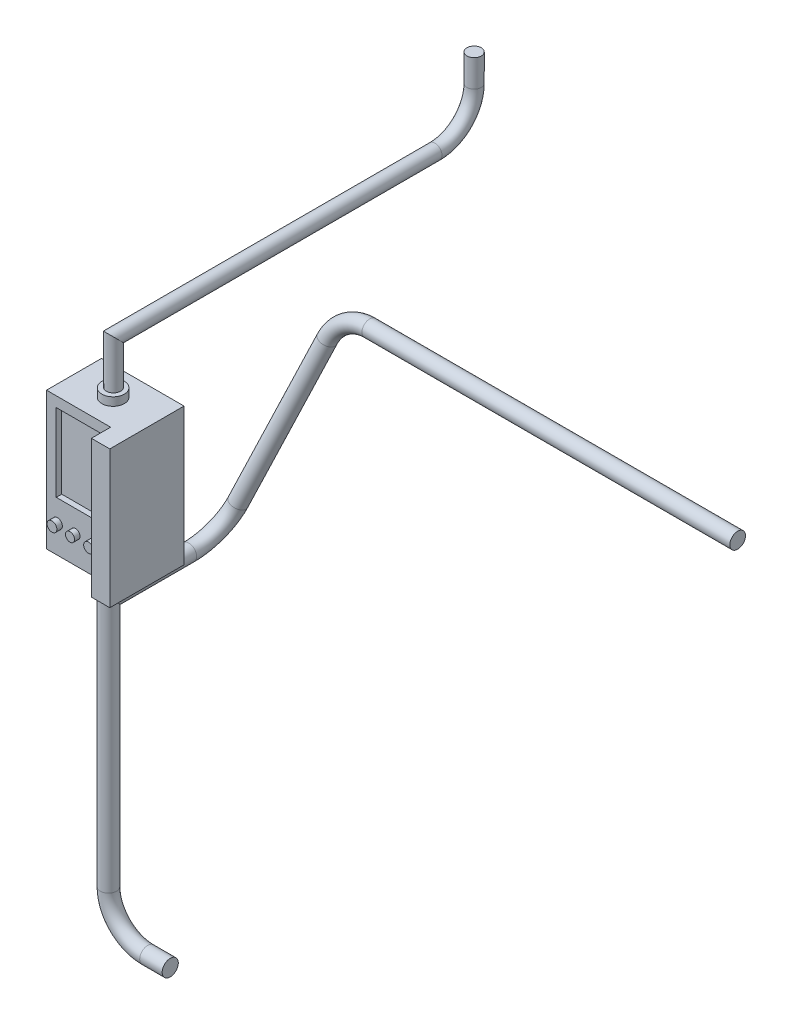
ISO-10303-21;
HEADER;
FILE_DESCRIPTION(('STEP AP214'),'2;1');
FILE_NAME('part.step','',(''),(''),'','','');
FILE_SCHEMA(('AUTOMOTIVE_DESIGN { 1 0 10303 214 1 1 1 1 }'));
ENDSEC;
DATA;
#1=APPLICATION_CONTEXT('core data for automotive mechanical design processes');
#2=APPLICATION_PROTOCOL_DEFINITION('international standard','automotive_design',2000,#1);
#3=PRODUCT_CONTEXT('',#1,'mechanical');
#4=PRODUCT('Part','Part','',(#3));
#5=PRODUCT_RELATED_PRODUCT_CATEGORY('part','',(#4));
#6=PRODUCT_DEFINITION_FORMATION('','',#4);
#7=PRODUCT_DEFINITION_CONTEXT('part definition',#1,'design');
#8=PRODUCT_DEFINITION('design','',#6,#7);
#9=PRODUCT_DEFINITION_SHAPE('','',#8);
#10=(LENGTH_UNIT() NAMED_UNIT(*) SI_UNIT(.MILLI.,.METRE.));
#11=(NAMED_UNIT(*) PLANE_ANGLE_UNIT() SI_UNIT($,.RADIAN.));
#12=(NAMED_UNIT(*) SI_UNIT($,.STERADIAN.) SOLID_ANGLE_UNIT());
#13=UNCERTAINTY_MEASURE_WITH_UNIT(LENGTH_MEASURE(1.E-05),#10,'distance_accuracy_value','');
#14=(GEOMETRIC_REPRESENTATION_CONTEXT(3) GLOBAL_UNCERTAINTY_ASSIGNED_CONTEXT((#13)) GLOBAL_UNIT_ASSIGNED_CONTEXT((#10,
#11,#12)) REPRESENTATION_CONTEXT('',''));
#15=CARTESIAN_POINT('',(0.,0.,0.));
#16=DIRECTION('',(0.,0.,1.));
#17=DIRECTION('',(1.,0.,0.));
#18=AXIS2_PLACEMENT_3D('',#15,#16,#17);
#19=CARTESIAN_POINT('',(-15.1656838034882,-1.44697494777078,10.0810756569558));
#20=DIRECTION('',(0.,-1.,0.));
#21=DIRECTION('',(1.,0.,0.));
#22=AXIS2_PLACEMENT_3D('',#19,#20,#21);
#23=CYLINDRICAL_SURFACE('',#22,2.05256225198221);
#24=CARTESIAN_POINT('',(-15.1656838034882,-1.44697494777078,10.0810756569558));
#25=DIRECTION('',(0.,-1.,0.));
#26=DIRECTION('',(0.,0.,-1.));
#27=AXIS2_PLACEMENT_3D('',#24,#25,#26);
#28=CIRCLE('',#27,2.05256225198221);
#29=CARTESIAN_POINT('',(-15.1656838034882,-1.44697494777078,8.02851340497361));
#30=VERTEX_POINT('',#29);
#31=EDGE_CURVE('E12',#30,#30,#28,.T.);
#32=ORIENTED_EDGE('',*,*,#31,.T.);
#33=EDGE_LOOP('',(#32));
#34=FACE_BOUND('',#33,.T.);
#35=CARTESIAN_POINT('',(-15.1656838034882,-75.1126954262071,10.0810756569558));
#36=DIRECTION('',(0.,-1.,0.));
#37=DIRECTION('',(0.,0.,-1.));
#38=AXIS2_PLACEMENT_3D('',#35,#36,#37);
#39=CIRCLE('',#38,2.05256225198221);
#40=CARTESIAN_POINT('',(-17.2182460554704,-75.1126954262071,10.0810756569558));
#41=VERTEX_POINT('',#40);
#42=EDGE_CURVE('E673',#41,#41,#39,.T.);
#43=ORIENTED_EDGE('',*,*,#42,.F.);
#44=EDGE_LOOP('',(#43));
#45=FACE_BOUND('',#44,.T.);
#46=CARTESIAN_POINT('',(-17.1707576265818,-11.6379271491596,9.6421100977065));
#47=CARTESIAN_POINT('',(-17.1707562385758,-11.6683769514016,9.64210011184391));
#48=CARTESIAN_POINT('',(-17.1700462371276,-11.6988839868901,9.6388263052876));
#49=CARTESIAN_POINT('',(-17.1673168978783,-11.7587317031309,9.62663833255918));
#50=CARTESIAN_POINT('',(-17.16529057085,-11.7880652654225,9.61769406436042));
#51=CARTESIAN_POINT('',(-17.1574559452225,-11.8750724914424,9.58474539158271));
#52=CARTESIAN_POINT('',(-17.1499101080387,-11.9301978462975,9.55478500641295));
#53=CARTESIAN_POINT('',(-17.1312579493921,-12.0361435780843,9.48882960335566));
#54=CARTESIAN_POINT('',(-17.1201222844179,-12.0869239524873,9.4527860603048));
#55=CARTESIAN_POINT('',(-17.089517100964,-12.2052225727835,9.36352469162417));
#56=CARTESIAN_POINT('',(-17.0684925013067,-12.2714632113716,9.30913033692371));
#57=CARTESIAN_POINT('',(-17.0201043276044,-12.4006268944419,9.19915403198198));
#58=CARTESIAN_POINT('',(-16.992732005946,-12.4635452122737,9.14357053986423));
#59=CARTESIAN_POINT('',(-16.9315867417749,-12.5863384747313,9.03294502015295));
#60=CARTESIAN_POINT('',(-16.8978331552121,-12.6462219457306,8.97790187135118));
#61=CARTESIAN_POINT('',(-16.8236732282258,-12.7630282868898,8.86929668361847));
#62=CARTESIAN_POINT('',(-16.7832722099263,-12.819953477943,8.81573349953127));
#63=CARTESIAN_POINT('',(-16.6748289474755,-12.9565819078633,8.68622557334252));
#64=CARTESIAN_POINT('',(-16.6027258677566,-13.0343983672529,8.61160970349412));
#65=CARTESIAN_POINT('',(-16.4426536892445,-13.1805640620557,8.47057628692153));
#66=CARTESIAN_POINT('',(-16.354709637301,-13.2489279459731,8.40414607280802));
#67=CARTESIAN_POINT('',(-16.1855276073578,-13.3579644436196,8.29770631448137));
#68=CARTESIAN_POINT('',(-16.1076526530937,-13.4013582477186,8.25516822737148));
#69=CARTESIAN_POINT('',(-15.9430615737329,-13.4785108817884,8.17926335211292));
#70=CARTESIAN_POINT('',(-15.8563498495212,-13.5122744762724,8.14589202904198));
#71=CARTESIAN_POINT('',(-15.6747242846835,-13.5681669639767,8.09035148658371));
#72=CARTESIAN_POINT('',(-15.5797376916956,-13.5901772695683,8.06829653026528));
#73=CARTESIAN_POINT('',(-15.3854407707692,-13.6199895276634,8.0379540099666));
#74=CARTESIAN_POINT('',(-15.2861357957448,-13.6278085844782,8.02964987357142));
#75=CARTESIAN_POINT('',(-15.1027132032089,-13.6283954885508,8.0277519671223));
#76=CARTESIAN_POINT('',(-15.0186114403326,-13.6232954493794,8.03209006447367));
#77=CARTESIAN_POINT('',(-14.8528367053792,-13.6027453078849,8.05078174414436));
#78=CARTESIAN_POINT('',(-14.7711638723318,-13.5872946142866,8.06513589862703));
#79=CARTESIAN_POINT('',(-14.6141395578294,-13.5475179312297,8.1023924587376));
#80=CARTESIAN_POINT('',(-14.5386879987864,-13.5233965711083,8.1250980351732));
#81=CARTESIAN_POINT('',(-14.3934058894673,-13.4675188421523,8.17776833738789));
#82=CARTESIAN_POINT('',(-14.3235770358122,-13.4357601802417,8.20773524337905));
#83=CARTESIAN_POINT('',(-14.1592021858172,-13.3496343987704,8.28890666111121));
#84=CARTESIAN_POINT('',(-14.0682437171712,-13.2916183110039,8.3435099872447));
#85=CARTESIAN_POINT('',(-13.900230683788,-13.1652871117331,8.46174050659935));
#86=CARTESIAN_POINT('',(-13.823217021185,-13.0969427481185,8.5253932986984));
#87=CARTESIAN_POINT('',(-13.7053836480379,-12.9756485580221,8.6371737374218));
#88=CARTESIAN_POINT('',(-13.6608698907733,-12.9247748778824,8.68374788424051));
#89=CARTESIAN_POINT('',(-13.5779356028464,-12.8198897757411,8.77875405057606));
#90=CARTESIAN_POINT('',(-13.5395151786688,-12.765878298927,8.82718610254258));
#91=CARTESIAN_POINT('',(-13.4686000602384,-12.6550266071301,8.92497747391148));
#92=CARTESIAN_POINT('',(-13.4360995661828,-12.5981892309758,8.97433583292432));
#93=CARTESIAN_POINT('',(-13.3768198169641,-12.4815953247047,9.07297049763243));
#94=CARTESIAN_POINT('',(-13.350036873152,-12.421840707396,9.12224683575631));
#95=CARTESIAN_POINT('',(-13.3072184498617,-12.3119177930637,9.20876356223566));
#96=CARTESIAN_POINT('',(-13.2901090322296,-12.262422333246,9.24632989161793));
#97=CARTESIAN_POINT('',(-13.2594301870704,-12.1604960642387,9.31900545639254));
#98=CARTESIAN_POINT('',(-13.2458620615339,-12.1080641840265,9.35411378461511));
#99=CARTESIAN_POINT('',(-13.2256900184427,-12.013598193288,9.41019896872631));
#100=CARTESIAN_POINT('',(-13.2181939034898,-11.9725249439042,9.43244628696262));
#101=CARTESIAN_POINT('',(-13.20559195093,-11.8875465769644,9.47159054421215));
#102=CARTESIAN_POINT('',(-13.2004779473846,-11.8436517298239,9.48850569657765));
#103=CARTESIAN_POINT('',(-13.1942939422607,-11.7671606348129,9.50948339634258));
#104=CARTESIAN_POINT('',(-13.1924606171015,-11.7353011056488,9.51590778381817));
#105=CARTESIAN_POINT('',(-13.1903540916777,-11.6709325399297,9.52331112171574));
#106=CARTESIAN_POINT('',(-13.1900775010031,-11.6384250697199,9.52430190585485));
#107=CARTESIAN_POINT('',(-13.1911099196835,-11.5738015708135,9.52065484486587));
#108=CARTESIAN_POINT('',(-13.1924176102456,-11.5416852389899,9.51602168123788));
#109=CARTESIAN_POINT('',(-13.1964767100878,-11.4785626507359,9.50203541745119));
#110=CARTESIAN_POINT('',(-13.1992319976936,-11.4475596165422,9.49266964051329));
#111=CARTESIAN_POINT('',(-13.2089533899926,-11.3603781883047,9.46085610887501));
#112=CARTESIAN_POINT('',(-13.2174927185067,-11.3059893379918,9.43414158898662));
#113=CARTESIAN_POINT('',(-13.2381294082466,-11.2011030505468,9.37499666223198));
#114=CARTESIAN_POINT('',(-13.2502444179536,-11.1506265219349,9.34253823114032));
#115=CARTESIAN_POINT('',(-13.2804751696835,-11.0426199177359,9.26810573422655));
#116=CARTESIAN_POINT('',(-13.2993073490884,-10.9857084481304,9.22552959705876));
#117=CARTESIAN_POINT('',(-13.3415191722809,-10.8747602763609,9.13885818501345));
#118=CARTESIAN_POINT('',(-13.3649033475438,-10.82072650776,9.0947614326703));
#119=CARTESIAN_POINT('',(-13.4162443654835,-10.7151013877025,9.00632561793709));
#120=CARTESIAN_POINT('',(-13.4441999753943,-10.6635093826054,8.96198662397888));
#121=CARTESIAN_POINT('',(-13.5047755142522,-10.5626728450185,8.87390787766344));
#122=CARTESIAN_POINT('',(-13.5373932589209,-10.5134272275379,8.83016785513681));
#123=CARTESIAN_POINT('',(-13.636843401428,-10.3770228917468,8.70772313210882));
#124=CARTESIAN_POINT('',(-13.7094429674093,-10.292673461405,8.6304325045257));
#125=CARTESIAN_POINT('',(-13.8718606716603,-10.134237543975,8.48390066694397));
#126=CARTESIAN_POINT('',(-13.9616467276544,-10.0601323708243,8.41464483917553));
#127=CARTESIAN_POINT('',(-14.1327961431566,-9.94356694224223,8.30524471239181));
#128=CARTESIAN_POINT('',(-14.2101401307153,-9.89791443684827,8.26223900768829));
#129=CARTESIAN_POINT('',(-14.3738978541586,-9.8162281563539,8.18522706381717));
#130=CARTESIAN_POINT('',(-14.4603004837665,-9.78018279028216,8.15120998034756));
#131=CARTESIAN_POINT('',(-14.6272646998079,-9.72445878957076,8.09875524956262));
#132=CARTESIAN_POINT('',(-14.7067826590744,-9.70314296796166,8.07875265290483));
#133=CARTESIAN_POINT('',(-14.8696113346887,-9.67040813327407,8.04829493826342));
#134=CARTESIAN_POINT('',(-14.9529198587521,-9.65898347430356,8.03783437348912));
#135=CARTESIAN_POINT('',(-15.1212233335842,-9.64680953527335,8.02725911346089));
#136=CARTESIAN_POINT('',(-15.2062224341695,-9.64609095188878,8.02717416236463));
#137=CARTESIAN_POINT('',(-15.3749801257291,-9.6554353944807,8.03746208867531));
#138=CARTESIAN_POINT('',(-15.4587385441576,-9.66549990608698,8.04783640708569));
#139=CARTESIAN_POINT('',(-15.6190763152071,-9.69499279951662,8.07762375994301));
#140=CARTESIAN_POINT('',(-15.695809485336,-9.71400569009518,8.09663454353421));
#141=CARTESIAN_POINT('',(-15.844356952571,-9.7600694875636,8.14239905766324));
#142=CARTESIAN_POINT('',(-15.9161693766855,-9.7871234344497,8.16915571650168));
#143=CARTESIAN_POINT('',(-16.0812712926284,-9.86009541391372,8.24104562330932));
#144=CARTESIAN_POINT('',(-16.1717970485938,-9.90924060200667,8.28925954560956));
#145=CARTESIAN_POINT('',(-16.3405288702634,-10.0175924016071,8.39503779787191));
#146=CARTESIAN_POINT('',(-16.4187077770046,-10.0768206141768,8.4526221904352));
#147=CARTESIAN_POINT('',(-16.5895187968733,-10.2262075569568,8.59702461659752));
#148=CARTESIAN_POINT('',(-16.6767781137223,-10.3196969430244,8.68677030414259));
#149=CARTESIAN_POINT('',(-16.7913143596522,-10.4673483442454,8.82649339310361));
#150=CARTESIAN_POINT('',(-16.8267944358785,-10.5178549559429,8.87396765518812));
#151=CARTESIAN_POINT('',(-16.8925196339269,-10.6211541134422,8.97002362073492));
#152=CARTESIAN_POINT('',(-16.9227665096953,-10.6739458859102,9.01860494695434));
#153=CARTESIAN_POINT('',(-16.9883100043343,-10.8013865113274,9.13403516195702));
#154=CARTESIAN_POINT('',(-17.0214279891096,-10.8769876984115,9.20108738641287));
#155=CARTESIAN_POINT('',(-17.064195785077,-10.9940952754103,9.30007446246959));
#156=CARTESIAN_POINT('',(-17.0772941887342,-11.0337229933015,9.33278511067768));
#157=CARTESIAN_POINT('',(-17.1011913215978,-11.1146232516802,9.3969797190091));
#158=CARTESIAN_POINT('',(-17.1119914318608,-11.1558947865862,9.42846440647167));
#159=CARTESIAN_POINT('',(-17.1294291849901,-11.2328948134437,9.48326028915612));
#160=CARTESIAN_POINT('',(-17.1364674424433,-11.2682239745075,9.50700160429208));
#161=CARTESIAN_POINT('',(-17.1488525769852,-11.3411446468742,9.55138002339139));
#162=CARTESIAN_POINT('',(-17.1542003762616,-11.3787349113189,9.5720188166249));
#163=CARTESIAN_POINT('',(-17.1615338115833,-11.4446501917427,9.60175011034675));
#164=CARTESIAN_POINT('',(-17.1640478955334,-11.4721770870777,9.61243312985159));
#165=CARTESIAN_POINT('',(-17.16795154088,-11.5286074200084,9.62939642923683));
#166=CARTESIAN_POINT('',(-17.1693461576787,-11.5575040379397,9.63569648474448));
#167=CARTESIAN_POINT('',(-17.1703177234464,-11.5952206746369,9.64010483020651));
#168=CARTESIAN_POINT('',(-17.1704823078874,-11.6037435274243,9.64085396126065));
#169=CARTESIAN_POINT('',(-17.1707024511195,-11.6208184646108,9.64185798284877));
#170=CARTESIAN_POINT('',(-17.1707580166209,-11.6293705471784,9.64211290380196));
#171=CARTESIAN_POINT('',(-17.1707576265818,-11.6379271491596,9.6421100977065));
#172=B_SPLINE_CURVE_WITH_KNOTS('',3,(#46,#47,#48,#49,#50,#51,#52,#53,#54,#55,#56,#57,#58,#59,
#60,#61,#62,#63,#64,#65,#66,#67,#68,#69,#70,#71,#72,#73,#74,#75,#76,#77,#78,#79,#80,#81,#82,#83,
#84,#85,#86,#87,#88,#89,#90,#91,#92,#93,#94,#95,#96,#97,#98,#99,#100,#101,#102,#103,#104,#105,
#106,#107,#108,#109,#110,#111,#112,#113,#114,#115,#116,#117,#118,#119,#120,#121,#122,#123,#124,
#125,#126,#127,#128,#129,#130,#131,#132,#133,#134,#135,#136,#137,#138,#139,#140,#141,#142,#143,
#144,#145,#146,#147,#148,#149,#150,#151,#152,#153,#154,#155,#156,#157,#158,#159,#160,#161,#162,
#163,#164,#165,#166,#167,#168,#169,#170,#171),.UNSPECIFIED.,.T.,.F.,(4,2,2,2,2,2,2,2,2,2,2,2,2,
2,2,2,2,2,2,2,2,2,2,2,2,2,2,2,2,2,2,2,2,2,2,2,2,2,2,2,2,2,2,2,2,2,2,2,2,2,2,2,2,2,2,2,2,2,2,2,2,
2,4),(0.,0.0913056403874695,0.183100088593291,0.37118247259093,0.560842989144096,
0.825143184449923,1.08980979169786,1.35368611901524,1.61735219833802,2.00509292356575,
2.39222587235196,2.6874686149502,2.98256503283015,3.28058518179503,3.57824589635369,
3.83007477021042,4.081918030871,4.32817081762585,4.57449763352368,4.93525766742161,
5.29705930169088,5.54303419914769,5.78901339469353,6.03475029083835,6.28032816870983,
6.47354050045255,6.66682376884279,6.80850864896924,6.94970418890205,7.04694358063466,
7.14397111262753,7.24091793208794,7.33812582088723,7.5206615271591,7.70411368629688,
7.92439904528953,8.14490482852408,8.36535124633931,8.58569471827848,8.99067627697831,
9.39490909582418,9.69257768556846,9.98988549687453,10.2429584579724,10.4958868691861,
10.7495403427149,11.0032287675836,11.2461516274062,11.4891664435492,11.8284653420381,
12.168500491339,12.6344879312147,12.8679406377712,13.1013149486998,13.4197632279023,
13.5787898467863,13.737720634208,13.8670497253002,13.996308141851,14.0849689722862,
14.173227130515,14.1988862172159,14.2245437245199),.UNSPECIFIED.);
#173=CARTESIAN_POINT('',(-17.1707576265818,-11.6379271491596,9.6421100977065));
#174=VERTEX_POINT('',#173);
#175=EDGE_CURVE('E58',#174,#174,#172,.T.);
#176=ORIENTED_EDGE('',*,*,#175,.T.);
#177=EDGE_LOOP('',(#176));
#178=FACE_BOUND('',#177,.T.);
#179=ADVANCED_FACE('F54',(#34,#45,#178),#23,.T.);
#180=CARTESIAN_POINT('',(-2.79503351726008,33.5530250522292,17.2211825238552));
#181=DIRECTION('',(-1.,0.,0.));
#182=DIRECTION('',(0.,-1.,0.));
#183=AXIS2_PLACEMENT_3D('',#180,#181,#182);
#184=PLANE('',#183);
#185=DIRECTION('',(0.,1.,0.));
#186=VECTOR('',#185,1.);
#187=CARTESIAN_POINT('',(-2.79503351726008,33.5530250522292,3.22118252385515));
#188=LINE('',#187,#186);
#189=CARTESIAN_POINT('',(-2.79503351726008,-1.44697494777078,3.22118252385515));
#190=VERTEX_POINT('',#189);
#191=CARTESIAN_POINT('',(-2.79503351726008,33.5530250522292,3.22118252385515));
#192=VERTEX_POINT('',#191);
#193=EDGE_CURVE('E191',#190,#192,#188,.T.);
#194=ORIENTED_EDGE('',*,*,#193,.T.);
#195=DIRECTION('',(0.,0.,-1.));
#196=VECTOR('',#195,1.);
#197=CARTESIAN_POINT('',(-2.79503351726008,33.5530250522292,17.2211825238552));
#198=LINE('',#197,#196);
#199=CARTESIAN_POINT('',(-2.79503351726009,33.5530250522292,22.1211825238552));
#200=VERTEX_POINT('',#199);
#201=EDGE_CURVE('E218',#200,#192,#198,.T.);
#202=ORIENTED_EDGE('',*,*,#201,.F.);
#203=DIRECTION('',(0.,1.,0.));
#204=VECTOR('',#203,1.);
#205=CARTESIAN_POINT('',(-2.79503351726008,4.79872038171863,22.1211825238552));
#206=LINE('',#205,#204);
#207=CARTESIAN_POINT('',(-2.79503351726008,-1.44697494777078,22.1211825238552));
#208=VERTEX_POINT('',#207);
#209=EDGE_CURVE('E155',#208,#200,#206,.T.);
#210=ORIENTED_EDGE('',*,*,#209,.F.);
#211=DIRECTION('',(0.,0.,-1.));
#212=VECTOR('',#211,1.);
#213=CARTESIAN_POINT('',(-2.79503351726008,-1.44697494777078,17.2211825238552));
#214=LINE('',#213,#212);
#215=EDGE_CURVE('E203',#208,#190,#214,.T.);
#216=ORIENTED_EDGE('',*,*,#215,.T.);
#217=EDGE_LOOP('',(#194,#202,#210,#216));
#218=FACE_BOUND('',#217,.T.);
#219=ADVANCED_FACE('F56',(#218),#184,.F.);
#220=CARTESIAN_POINT('',(-23.7950335172601,33.5530250522292,17.2211825238552));
#221=DIRECTION('',(0.,-1.,0.));
#222=DIRECTION('',(0.,0.,-1.));
#223=AXIS2_PLACEMENT_3D('',#220,#221,#222);
#224=PLANE('',#223);
#225=CARTESIAN_POINT('',(-13.7667009731344,33.5530250522292,10.2983339924709));
#226=DIRECTION('',(0.,1.,0.));
#227=DIRECTION('',(0.,0.,1.));
#228=AXIS2_PLACEMENT_3D('',#225,#226,#227);
#229=CIRCLE('',#228,2.85205853885435);
#230=CARTESIAN_POINT('',(-13.7667009731344,33.5530250522292,13.1503925313252));
#231=VERTEX_POINT('',#230);
#232=EDGE_CURVE('E219',#231,#231,#229,.T.);
#233=ORIENTED_EDGE('',*,*,#232,.F.);
#234=EDGE_LOOP('',(#233));
#235=FACE_BOUND('',#234,.T.);
#236=DIRECTION('',(-1.,0.,0.));
#237=VECTOR('',#236,1.);
#238=CARTESIAN_POINT('',(-23.7950335172601,33.5530250522292,3.22118252385515));
#239=LINE('',#238,#237);
#240=CARTESIAN_POINT('',(-23.7950335172601,33.5530250522292,3.22118252385515));
#241=VERTEX_POINT('',#240);
#242=EDGE_CURVE('E206',#192,#241,#239,.T.);
#243=ORIENTED_EDGE('',*,*,#242,.T.);
#244=DIRECTION('',(0.,0.,-1.));
#245=VECTOR('',#244,1.);
#246=CARTESIAN_POINT('',(-23.7950335172601,33.5530250522292,17.2211825238552));
#247=LINE('',#246,#245);
#248=CARTESIAN_POINT('',(-23.7950335172601,33.5530250522292,17.2211825238552));
#249=VERTEX_POINT('',#248);
#250=EDGE_CURVE('E216',#249,#241,#247,.T.);
#251=ORIENTED_EDGE('',*,*,#250,.F.);
#252=DIRECTION('',(-1.,0.,0.));
#253=VECTOR('',#252,1.);
#254=CARTESIAN_POINT('',(-23.7950335172601,33.5530250522292,17.2211825238552));
#255=LINE('',#254,#253);
#256=CARTESIAN_POINT('',(-7.47858813150323,33.5530250522292,17.2211825238552));
#257=VERTEX_POINT('',#256);
#258=EDGE_CURVE('E161',#257,#249,#255,.T.);
#259=ORIENTED_EDGE('',*,*,#258,.F.);
#260=DIRECTION('',(0.,0.,-1.));
#261=VECTOR('',#260,1.);
#262=CARTESIAN_POINT('',(-7.47858813150323,33.5530250522292,22.1211825238552));
#263=LINE('',#262,#261);
#264=CARTESIAN_POINT('',(-7.47858813150323,33.5530250522292,22.1211825238552));
#265=VERTEX_POINT('',#264);
#266=EDGE_CURVE('E142',#265,#257,#263,.T.);
#267=ORIENTED_EDGE('',*,*,#266,.F.);
#268=DIRECTION('',(-1.,0.,0.));
#269=VECTOR('',#268,1.);
#270=CARTESIAN_POINT('',(-3.79211484142935,33.5530250522292,22.1211825238552));
#271=LINE('',#270,#269);
#272=EDGE_CURVE('E149',#200,#265,#271,.T.);
#273=ORIENTED_EDGE('',*,*,#272,.F.);
#274=ORIENTED_EDGE('',*,*,#201,.T.);
#275=EDGE_LOOP('',(#243,#251,#259,#267,#273,#274));
#276=FACE_BOUND('',#275,.T.);
#277=ADVANCED_FACE('F159',(#235,#276),#224,.F.);
#278=CARTESIAN_POINT('',(-23.7950335172601,33.5530250522292,17.2211825238552));
#279=DIRECTION('',(1.,0.,0.));
#280=DIRECTION('',(0.,1.,0.));
#281=AXIS2_PLACEMENT_3D('',#278,#279,#280);
#282=PLANE('',#281);
#283=DIRECTION('',(0.,-1.,0.));
#284=VECTOR('',#283,1.);
#285=CARTESIAN_POINT('',(-23.7950335172601,33.5530250522292,3.22118252385515));
#286=LINE('',#285,#284);
#287=CARTESIAN_POINT('',(-23.7950335172601,-1.44697494777078,3.22118252385515));
#288=VERTEX_POINT('',#287);
#289=EDGE_CURVE('E208',#241,#288,#286,.T.);
#290=ORIENTED_EDGE('',*,*,#289,.T.);
#291=DIRECTION('',(0.,0.,-1.));
#292=VECTOR('',#291,1.);
#293=CARTESIAN_POINT('',(-23.7950335172601,-1.44697494777078,17.2211825238552));
#294=LINE('',#293,#292);
#295=CARTESIAN_POINT('',(-23.7950335172601,-1.44697494777078,17.2211825238552));
#296=VERTEX_POINT('',#295);
#297=EDGE_CURVE('E213',#296,#288,#294,.T.);
#298=ORIENTED_EDGE('',*,*,#297,.F.);
#299=DIRECTION('',(0.,-1.,0.));
#300=VECTOR('',#299,1.);
#301=CARTESIAN_POINT('',(-23.7950335172601,33.5530250522292,17.2211825238552));
#302=LINE('',#301,#300);
#303=EDGE_CURVE('E198',#249,#296,#302,.T.);
#304=ORIENTED_EDGE('',*,*,#303,.F.);
#305=ORIENTED_EDGE('',*,*,#250,.T.);
#306=EDGE_LOOP('',(#290,#298,#304,#305));
#307=FACE_BOUND('',#306,.T.);
#308=ADVANCED_FACE('F259',(#307),#282,.F.);
#309=CARTESIAN_POINT('',(-23.7950335172601,-1.44697494777078,17.2211825238552));
#310=DIRECTION('',(0.,1.,0.));
#311=DIRECTION('',(0.,0.,1.));
#312=AXIS2_PLACEMENT_3D('',#309,#310,#311);
#313=PLANE('',#312);
#314=ORIENTED_EDGE('',*,*,#31,.F.);
#315=EDGE_LOOP('',(#314));
#316=FACE_BOUND('',#315,.T.);
#317=DIRECTION('',(1.,0.,0.));
#318=VECTOR('',#317,1.);
#319=CARTESIAN_POINT('',(-23.7950335172601,-1.44697494777078,3.22118252385515));
#320=LINE('',#319,#318);
#321=EDGE_CURVE('E199',#288,#190,#320,.T.);
#322=ORIENTED_EDGE('',*,*,#321,.T.);
#323=ORIENTED_EDGE('',*,*,#215,.F.);
#324=DIRECTION('',(1.,0.,0.));
#325=VECTOR('',#324,1.);
#326=CARTESIAN_POINT('',(-3.79211484142935,-1.44697494777078,22.1211825238552));
#327=LINE('',#326,#325);
#328=CARTESIAN_POINT('',(-7.47858813150323,-1.44697494777078,22.1211825238552));
#329=VERTEX_POINT('',#328);
#330=EDGE_CURVE('E148',#329,#208,#327,.T.);
#331=ORIENTED_EDGE('',*,*,#330,.F.);
#332=DIRECTION('',(0.,0.,-1.));
#333=VECTOR('',#332,1.);
#334=CARTESIAN_POINT('',(-7.47858813150323,-1.44697494777078,22.1211825238552));
#335=LINE('',#334,#333);
#336=CARTESIAN_POINT('',(-7.47858813150323,-1.44697494777078,17.2211825238552));
#337=VERTEX_POINT('',#336);
#338=EDGE_CURVE('E144',#329,#337,#335,.T.);
#339=ORIENTED_EDGE('',*,*,#338,.T.);
#340=DIRECTION('',(1.,0.,0.));
#341=VECTOR('',#340,1.);
#342=CARTESIAN_POINT('',(-23.7950335172601,-1.44697494777078,17.2211825238552));
#343=LINE('',#342,#341);
#344=EDGE_CURVE('E201',#296,#337,#343,.T.);
#345=ORIENTED_EDGE('',*,*,#344,.F.);
#346=ORIENTED_EDGE('',*,*,#297,.T.);
#347=EDGE_LOOP('',(#322,#323,#331,#339,#345,#346));
#348=FACE_BOUND('',#347,.T.);
#349=ADVANCED_FACE('F250',(#316,#348),#313,.F.);
#350=CARTESIAN_POINT('',(-3.79211484142935,4.79872038171863,17.2211825238552));
#351=DIRECTION('',(0.,0.,1.));
#352=DIRECTION('',(1.,0.,0.));
#353=AXIS2_PLACEMENT_3D('',#350,#351,#352);
#354=PLANE('',#353);
#355=CARTESIAN_POINT('',(-11.6962757974124,5.58898372160033,17.2211825238552));
#356=DIRECTION('',(0.,0.,1.));
#357=DIRECTION('',(1.,0.,0.));
#358=AXIS2_PLACEMENT_3D('',#355,#356,#357);
#359=CIRCLE('',#358,1.2472440046638);
#360=CARTESIAN_POINT('',(-10.4490317927486,5.58898372160033,17.2211825238552));
#361=VERTEX_POINT('',#360);
#362=EDGE_CURVE('E233',#361,#361,#359,.T.);
#363=ORIENTED_EDGE('',*,*,#362,.F.);
#364=EDGE_LOOP('',(#363));
#365=FACE_BOUND('',#364,.T.);
#366=CARTESIAN_POINT('',(-16.4212622631356,5.58898372160033,17.2211825238552));
#367=DIRECTION('',(0.,0.,1.));
#368=DIRECTION('',(1.,0.,0.));
#369=AXIS2_PLACEMENT_3D('',#366,#367,#368);
#370=CIRCLE('',#369,1.15096971644149);
#371=CARTESIAN_POINT('',(-15.2702925466941,5.58898372160033,17.2211825238552));
#372=VERTEX_POINT('',#371);
#373=EDGE_CURVE('E232',#372,#372,#370,.T.);
#374=ORIENTED_EDGE('',*,*,#373,.F.);
#375=EDGE_LOOP('',(#374));
#376=FACE_BOUND('',#375,.T.);
#377=CARTESIAN_POINT('',(-21.0060531802151,5.58898372160033,17.2211825238552));
#378=DIRECTION('',(0.,0.,1.));
#379=DIRECTION('',(1.,0.,0.));
#380=AXIS2_PLACEMENT_3D('',#377,#378,#379);
#381=CIRCLE('',#380,1.24837859010856);
#382=CARTESIAN_POINT('',(-19.7576745901066,5.58898372160033,17.2211825238552));
#383=VERTEX_POINT('',#382);
#384=EDGE_CURVE('E239',#383,#383,#381,.T.);
#385=ORIENTED_EDGE('',*,*,#384,.F.);
#386=EDGE_LOOP('',(#385));
#387=FACE_BOUND('',#386,.T.);
#388=DIRECTION('',(0.,-1.,0.));
#389=VECTOR('',#388,1.);
#390=CARTESIAN_POINT('',(-7.47858813150322,4.79872038171863,17.2211825238552));
#391=LINE('',#390,#389);
#392=EDGE_CURVE('E76',#257,#337,#391,.T.);
#393=ORIENTED_EDGE('',*,*,#392,.F.);
#394=ORIENTED_EDGE('',*,*,#258,.T.);
#395=ORIENTED_EDGE('',*,*,#303,.T.);
#396=ORIENTED_EDGE('',*,*,#344,.T.);
#397=EDGE_LOOP('',(#393,#394,#395,#396));
#398=FACE_BOUND('',#397,.T.);
#399=DIRECTION('',(0.,1.,0.));
#400=VECTOR('',#399,1.);
#401=CARTESIAN_POINT('',(-9.00534627880155,30.9557520115547,17.2211825238552));
#402=LINE('',#401,#400);
#403=CARTESIAN_POINT('',(-9.00534627880155,11.1653447041178,17.2211825238552));
#404=VERTEX_POINT('',#403);
#405=CARTESIAN_POINT('',(-9.00534627880155,30.9557520115547,17.2211825238552));
#406=VERTEX_POINT('',#405);
#407=EDGE_CURVE('E84',#404,#406,#402,.T.);
#408=ORIENTED_EDGE('',*,*,#407,.F.);
#409=DIRECTION('',(1.,0.,0.));
#410=VECTOR('',#409,1.);
#411=CARTESIAN_POINT('',(-21.3184685726939,11.1653447041178,17.2211825238552));
#412=LINE('',#411,#410);
#413=CARTESIAN_POINT('',(-21.3184685726939,11.1653447041178,17.2211825238552));
#414=VERTEX_POINT('',#413);
#415=EDGE_CURVE('E172',#414,#404,#412,.T.);
#416=ORIENTED_EDGE('',*,*,#415,.F.);
#417=DIRECTION('',(0.,-1.,0.));
#418=VECTOR('',#417,1.);
#419=CARTESIAN_POINT('',(-21.3184685726939,30.9557520115547,17.2211825238552));
#420=LINE('',#419,#418);
#421=CARTESIAN_POINT('',(-21.3184685726939,30.9557520115547,17.2211825238552));
#422=VERTEX_POINT('',#421);
#423=EDGE_CURVE('E184',#422,#414,#420,.T.);
#424=ORIENTED_EDGE('',*,*,#423,.F.);
#425=DIRECTION('',(-1.,0.,0.));
#426=VECTOR('',#425,1.);
#427=CARTESIAN_POINT('',(-21.3184685726939,30.9557520115547,17.2211825238552));
#428=LINE('',#427,#426);
#429=EDGE_CURVE('E163',#406,#422,#428,.T.);
#430=ORIENTED_EDGE('',*,*,#429,.F.);
#431=EDGE_LOOP('',(#408,#416,#424,#430));
#432=FACE_BOUND('',#431,.T.);
#433=ADVANCED_FACE('F261',(#365,#376,#387,#398,#432),#354,.T.);
#434=CARTESIAN_POINT('',(-3.79211484142935,4.79872038171863,3.22118252385515));
#435=DIRECTION('',(0.,0.,1.));
#436=DIRECTION('',(1.,0.,0.));
#437=AXIS2_PLACEMENT_3D('',#434,#435,#436);
#438=PLANE('',#437);
#439=ORIENTED_EDGE('',*,*,#193,.F.);
#440=ORIENTED_EDGE('',*,*,#321,.F.);
#441=ORIENTED_EDGE('',*,*,#289,.F.);
#442=ORIENTED_EDGE('',*,*,#242,.F.);
#443=EDGE_LOOP('',(#439,#440,#441,#442));
#444=FACE_BOUND('',#443,.T.);
#445=ADVANCED_FACE('F255',(#444),#438,.F.);
#446=CARTESIAN_POINT('',(-9.00534627880155,30.9557520115547,15.8211825238552));
#447=DIRECTION('',(1.,0.,0.));
#448=DIRECTION('',(0.,0.,-1.));
#449=AXIS2_PLACEMENT_3D('',#446,#447,#448);
#450=PLANE('',#449);
#451=ORIENTED_EDGE('',*,*,#407,.T.);
#452=DIRECTION('',(0.,0.,1.));
#453=VECTOR('',#452,1.);
#454=CARTESIAN_POINT('',(-9.00534627880155,30.9557520115547,15.8211825238552));
#455=LINE('',#454,#453);
#456=CARTESIAN_POINT('',(-9.00534627880155,30.9557520115547,15.8211825238552));
#457=VERTEX_POINT('',#456);
#458=EDGE_CURVE('E180',#457,#406,#455,.T.);
#459=ORIENTED_EDGE('',*,*,#458,.F.);
#460=DIRECTION('',(0.,1.,0.));
#461=VECTOR('',#460,1.);
#462=CARTESIAN_POINT('',(-9.00534627880155,30.9557520115547,15.8211825238552));
#463=LINE('',#462,#461);
#464=CARTESIAN_POINT('',(-9.00534627880155,11.1653447041178,15.8211825238552));
#465=VERTEX_POINT('',#464);
#466=EDGE_CURVE('E168',#465,#457,#463,.T.);
#467=ORIENTED_EDGE('',*,*,#466,.F.);
#468=DIRECTION('',(0.,0.,1.));
#469=VECTOR('',#468,1.);
#470=CARTESIAN_POINT('',(-9.00534627880155,11.1653447041178,15.8211825238552));
#471=LINE('',#470,#469);
#472=EDGE_CURVE('E189',#465,#404,#471,.T.);
#473=ORIENTED_EDGE('',*,*,#472,.T.);
#474=EDGE_LOOP('',(#451,#459,#467,#473));
#475=FACE_BOUND('',#474,.T.);
#476=ADVANCED_FACE('F274',(#475),#450,.F.);
#477=CARTESIAN_POINT('',(-21.3184685726939,11.1653447041178,15.8211825238552));
#478=DIRECTION('',(0.,-1.,0.));
#479=DIRECTION('',(0.,0.,-1.));
#480=AXIS2_PLACEMENT_3D('',#477,#478,#479);
#481=PLANE('',#480);
#482=ORIENTED_EDGE('',*,*,#415,.T.);
#483=ORIENTED_EDGE('',*,*,#472,.F.);
#484=DIRECTION('',(1.,0.,0.));
#485=VECTOR('',#484,1.);
#486=CARTESIAN_POINT('',(-21.3184685726939,11.1653447041178,15.8211825238552));
#487=LINE('',#486,#485);
#488=CARTESIAN_POINT('',(-21.3184685726939,11.1653447041178,15.8211825238552));
#489=VERTEX_POINT('',#488);
#490=EDGE_CURVE('E178',#489,#465,#487,.T.);
#491=ORIENTED_EDGE('',*,*,#490,.F.);
#492=DIRECTION('',(0.,0.,1.));
#493=VECTOR('',#492,1.);
#494=CARTESIAN_POINT('',(-21.3184685726939,11.1653447041178,15.8211825238552));
#495=LINE('',#494,#493);
#496=EDGE_CURVE('E192',#489,#414,#495,.T.);
#497=ORIENTED_EDGE('',*,*,#496,.T.);
#498=EDGE_LOOP('',(#482,#483,#491,#497));
#499=FACE_BOUND('',#498,.T.);
#500=ADVANCED_FACE('F279',(#499),#481,.F.);
#501=CARTESIAN_POINT('',(-21.3184685726939,30.9557520115547,15.8211825238552));
#502=DIRECTION('',(-1.,0.,0.));
#503=DIRECTION('',(0.,0.,1.));
#504=AXIS2_PLACEMENT_3D('',#501,#502,#503);
#505=PLANE('',#504);
#506=ORIENTED_EDGE('',*,*,#423,.T.);
#507=ORIENTED_EDGE('',*,*,#496,.F.);
#508=DIRECTION('',(0.,-1.,0.));
#509=VECTOR('',#508,1.);
#510=CARTESIAN_POINT('',(-21.3184685726939,30.9557520115547,15.8211825238552));
#511=LINE('',#510,#509);
#512=CARTESIAN_POINT('',(-21.3184685726939,30.9557520115547,15.8211825238552));
#513=VERTEX_POINT('',#512);
#514=EDGE_CURVE('E175',#513,#489,#511,.T.);
#515=ORIENTED_EDGE('',*,*,#514,.F.);
#516=DIRECTION('',(0.,0.,1.));
#517=VECTOR('',#516,1.);
#518=CARTESIAN_POINT('',(-21.3184685726939,30.9557520115547,15.8211825238552));
#519=LINE('',#518,#517);
#520=EDGE_CURVE('E194',#513,#422,#519,.T.);
#521=ORIENTED_EDGE('',*,*,#520,.T.);
#522=EDGE_LOOP('',(#506,#507,#515,#521));
#523=FACE_BOUND('',#522,.T.);
#524=ADVANCED_FACE('F281',(#523),#505,.F.);
#525=CARTESIAN_POINT('',(-21.3184685726939,30.9557520115547,15.8211825238552));
#526=DIRECTION('',(0.,1.,0.));
#527=DIRECTION('',(0.,0.,1.));
#528=AXIS2_PLACEMENT_3D('',#525,#526,#527);
#529=PLANE('',#528);
#530=ORIENTED_EDGE('',*,*,#429,.T.);
#531=ORIENTED_EDGE('',*,*,#520,.F.);
#532=DIRECTION('',(-1.,0.,0.));
#533=VECTOR('',#532,1.);
#534=CARTESIAN_POINT('',(-21.3184685726939,30.9557520115547,15.8211825238552));
#535=LINE('',#534,#533);
#536=EDGE_CURVE('E171',#457,#513,#535,.T.);
#537=ORIENTED_EDGE('',*,*,#536,.F.);
#538=ORIENTED_EDGE('',*,*,#458,.T.);
#539=EDGE_LOOP('',(#530,#531,#537,#538));
#540=FACE_BOUND('',#539,.T.);
#541=ADVANCED_FACE('F270',(#540),#529,.F.);
#542=CARTESIAN_POINT('',(-3.79211484142935,4.79872038171863,15.8211825238552));
#543=DIRECTION('',(0.,0.,1.));
#544=DIRECTION('',(1.,0.,0.));
#545=AXIS2_PLACEMENT_3D('',#542,#543,#544);
#546=PLANE('',#545);
#547=ORIENTED_EDGE('',*,*,#466,.T.);
#548=ORIENTED_EDGE('',*,*,#536,.T.);
#549=ORIENTED_EDGE('',*,*,#514,.T.);
#550=ORIENTED_EDGE('',*,*,#490,.T.);
#551=EDGE_LOOP('',(#547,#548,#549,#550));
#552=FACE_BOUND('',#551,.T.);
#553=ADVANCED_FACE('F277',(#552),#546,.T.);
#554=CARTESIAN_POINT('',(-7.47858813150322,4.79872038171863,22.1211825238552));
#555=DIRECTION('',(1.,0.,0.));
#556=DIRECTION('',(0.,1.,0.));
#557=AXIS2_PLACEMENT_3D('',#554,#555,#556);
#558=PLANE('',#557);
#559=ORIENTED_EDGE('',*,*,#392,.T.);
#560=ORIENTED_EDGE('',*,*,#338,.F.);
#561=DIRECTION('',(0.,-1.,0.));
#562=VECTOR('',#561,1.);
#563=CARTESIAN_POINT('',(-7.47858813150322,4.79872038171863,22.1211825238552));
#564=LINE('',#563,#562);
#565=EDGE_CURVE('E138',#265,#329,#564,.T.);
#566=ORIENTED_EDGE('',*,*,#565,.F.);
#567=ORIENTED_EDGE('',*,*,#266,.T.);
#568=EDGE_LOOP('',(#559,#560,#566,#567));
#569=FACE_BOUND('',#568,.T.);
#570=ADVANCED_FACE('F140',(#569),#558,.F.);
#571=CARTESIAN_POINT('',(-3.79211484142935,4.79872038171863,22.1211825238552));
#572=DIRECTION('',(0.,0.,1.));
#573=DIRECTION('',(1.,0.,0.));
#574=AXIS2_PLACEMENT_3D('',#571,#572,#573);
#575=PLANE('',#574);
#576=ORIENTED_EDGE('',*,*,#272,.T.);
#577=ORIENTED_EDGE('',*,*,#565,.T.);
#578=ORIENTED_EDGE('',*,*,#330,.T.);
#579=ORIENTED_EDGE('',*,*,#209,.T.);
#580=EDGE_LOOP('',(#576,#577,#578,#579));
#581=FACE_BOUND('',#580,.T.);
#582=ADVANCED_FACE('F153',(#581),#575,.T.);
#583=CARTESIAN_POINT('',(-21.0060531802151,5.58898372160033,18.6211825238552));
#584=DIRECTION('',(0.,0.,-1.));
#585=DIRECTION('',(-1.,0.,0.));
#586=AXIS2_PLACEMENT_3D('',#583,#584,#585);
#587=CYLINDRICAL_SURFACE('',#586,1.24837859010856);
#588=CARTESIAN_POINT('',(-21.0060531802151,5.58898372160033,18.6211825238552));
#589=DIRECTION('',(0.,0.,1.));
#590=DIRECTION('',(1.,0.,0.));
#591=AXIS2_PLACEMENT_3D('',#588,#589,#590);
#592=CIRCLE('',#591,1.24837859010856);
#593=CARTESIAN_POINT('',(-19.7576745901066,5.58898372160033,18.6211825238552));
#594=VERTEX_POINT('',#593);
#595=EDGE_CURVE('E242',#594,#594,#592,.T.);
#596=ORIENTED_EDGE('',*,*,#595,.F.);
#597=EDGE_LOOP('',(#596));
#598=FACE_BOUND('',#597,.T.);
#599=ORIENTED_EDGE('',*,*,#384,.T.);
#600=EDGE_LOOP('',(#599));
#601=FACE_BOUND('',#600,.T.);
#602=ADVANCED_FACE('F360',(#598,#601),#587,.T.);
#603=CARTESIAN_POINT('',(-21.0060531802151,5.58898372160033,18.6211825238552));
#604=DIRECTION('',(0.,0.,1.));
#605=DIRECTION('',(1.,0.,0.));
#606=AXIS2_PLACEMENT_3D('',#603,#604,#605);
#607=PLANE('',#606);
#608=ORIENTED_EDGE('',*,*,#595,.T.);
#609=EDGE_LOOP('',(#608));
#610=FACE_BOUND('',#609,.T.);
#611=ADVANCED_FACE('F356',(#610),#607,.T.);
#612=CARTESIAN_POINT('',(-16.4212622631356,5.58898372160033,18.6211825238552));
#613=DIRECTION('',(0.,0.,-1.));
#614=DIRECTION('',(-1.,0.,0.));
#615=AXIS2_PLACEMENT_3D('',#612,#613,#614);
#616=CYLINDRICAL_SURFACE('',#615,1.15096971644149);
#617=CARTESIAN_POINT('',(-16.4212622631356,5.58898372160033,18.6211825238552));
#618=DIRECTION('',(0.,0.,1.));
#619=DIRECTION('',(1.,0.,0.));
#620=AXIS2_PLACEMENT_3D('',#617,#618,#619);
#621=CIRCLE('',#620,1.15096971644149);
#622=CARTESIAN_POINT('',(-15.2702925466941,5.58898372160033,18.6211825238552));
#623=VERTEX_POINT('',#622);
#624=EDGE_CURVE('E236',#623,#623,#621,.T.);
#625=ORIENTED_EDGE('',*,*,#624,.F.);
#626=EDGE_LOOP('',(#625));
#627=FACE_BOUND('',#626,.T.);
#628=ORIENTED_EDGE('',*,*,#373,.T.);
#629=EDGE_LOOP('',(#628));
#630=FACE_BOUND('',#629,.T.);
#631=ADVANCED_FACE('F352',(#627,#630),#616,.T.);
#632=CARTESIAN_POINT('',(-16.4212622631356,5.58898372160033,18.6211825238552));
#633=DIRECTION('',(0.,0.,1.));
#634=DIRECTION('',(1.,0.,0.));
#635=AXIS2_PLACEMENT_3D('',#632,#633,#634);
#636=PLANE('',#635);
#637=ORIENTED_EDGE('',*,*,#624,.T.);
#638=EDGE_LOOP('',(#637));
#639=FACE_BOUND('',#638,.T.);
#640=ADVANCED_FACE('F348',(#639),#636,.T.);
#641=CARTESIAN_POINT('',(-11.6962757974124,5.58898372160033,18.6211825238552));
#642=DIRECTION('',(0.,0.,-1.));
#643=DIRECTION('',(-1.,0.,0.));
#644=AXIS2_PLACEMENT_3D('',#641,#642,#643);
#645=CYLINDRICAL_SURFACE('',#644,1.2472440046638);
#646=CARTESIAN_POINT('',(-11.6962757974124,5.58898372160033,18.6211825238552));
#647=DIRECTION('',(0.,0.,1.));
#648=DIRECTION('',(1.,0.,0.));
#649=AXIS2_PLACEMENT_3D('',#646,#647,#648);
#650=CIRCLE('',#649,1.2472440046638);
#651=CARTESIAN_POINT('',(-10.4490317927486,5.58898372160033,18.6211825238552));
#652=VERTEX_POINT('',#651);
#653=EDGE_CURVE('E229',#652,#652,#650,.T.);
#654=ORIENTED_EDGE('',*,*,#653,.F.);
#655=EDGE_LOOP('',(#654));
#656=FACE_BOUND('',#655,.T.);
#657=ORIENTED_EDGE('',*,*,#362,.T.);
#658=EDGE_LOOP('',(#657));
#659=FACE_BOUND('',#658,.T.);
#660=ADVANCED_FACE('F344',(#656,#659),#645,.T.);
#661=CARTESIAN_POINT('',(-11.6962757974124,5.58898372160033,18.6211825238552));
#662=DIRECTION('',(0.,0.,1.));
#663=DIRECTION('',(1.,0.,0.));
#664=AXIS2_PLACEMENT_3D('',#661,#662,#663);
#665=PLANE('',#664);
#666=ORIENTED_EDGE('',*,*,#653,.T.);
#667=EDGE_LOOP('',(#666));
#668=FACE_BOUND('',#667,.T.);
#669=ADVANCED_FACE('F340',(#668),#665,.T.);
#670=CARTESIAN_POINT('',(-13.7667009731344,35.6530250522292,10.2983339924709));
#671=DIRECTION('',(0.,-1.,0.));
#672=DIRECTION('',(0.,0.,-1.));
#673=AXIS2_PLACEMENT_3D('',#670,#671,#672);
#674=CYLINDRICAL_SURFACE('',#673,2.85205853885435);
#675=CARTESIAN_POINT('',(-13.7667009731344,35.6530250522292,10.2983339924709));
#676=DIRECTION('',(0.,1.,0.));
#677=DIRECTION('',(0.,0.,1.));
#678=AXIS2_PLACEMENT_3D('',#675,#676,#677);
#679=CIRCLE('',#678,2.85205853885435);
#680=CARTESIAN_POINT('',(-13.7667009731344,35.6530250522292,13.1503925313252));
#681=VERTEX_POINT('',#680);
#682=EDGE_CURVE('E228',#681,#681,#679,.T.);
#683=ORIENTED_EDGE('',*,*,#682,.F.);
#684=EDGE_LOOP('',(#683));
#685=FACE_BOUND('',#684,.T.);
#686=ORIENTED_EDGE('',*,*,#232,.T.);
#687=EDGE_LOOP('',(#686));
#688=FACE_BOUND('',#687,.T.);
#689=ADVANCED_FACE('F336',(#685,#688),#674,.T.);
#690=CARTESIAN_POINT('',(-13.7667009731344,35.6530250522292,10.2983339924709));
#691=DIRECTION('',(0.,1.,0.));
#692=DIRECTION('',(0.,0.,1.));
#693=AXIS2_PLACEMENT_3D('',#690,#691,#692);
#694=PLANE('',#693);
#695=CARTESIAN_POINT('',(-13.8475553680502,35.6530250522292,10.128813460874));
#696=DIRECTION('',(0.,1.,0.));
#697=DIRECTION('',(0.,0.,1.));
#698=AXIS2_PLACEMENT_3D('',#695,#696,#697);
#699=CIRCLE('',#698,1.82119356321451);
#700=CARTESIAN_POINT('',(-13.8475553680502,35.6530250522292,11.9500070240886));
#701=VERTEX_POINT('',#700);
#702=EDGE_CURVE('E68',#701,#701,#699,.T.);
#703=ORIENTED_EDGE('',*,*,#702,.F.);
#704=EDGE_LOOP('',(#703));
#705=FACE_BOUND('',#704,.T.);
#706=ORIENTED_EDGE('',*,*,#682,.T.);
#707=EDGE_LOOP('',(#706));
#708=FACE_BOUND('',#707,.T.);
#709=ADVANCED_FACE('F332',(#705,#708),#694,.T.);
#710=CARTESIAN_POINT('',(-13.8475553680502,37.0530250522292,10.128813460874));
#711=DIRECTION('',(0.,-1.,0.));
#712=DIRECTION('',(0.,0.,-1.));
#713=AXIS2_PLACEMENT_3D('',#710,#711,#712);
#714=CYLINDRICAL_SURFACE('',#713,1.82119356321451);
#715=ORIENTED_EDGE('',*,*,#702,.T.);
#716=EDGE_LOOP('',(#715));
#717=FACE_BOUND('',#716,.T.);
#718=CARTESIAN_POINT('',(-13.8475553680502,46.7140007580177,10.128813460874));
#719=DIRECTION('',(0.,0.707106781186548,-0.707106781186548));
#720=DIRECTION('',(0.,0.707106781186548,0.707106781186548));
#721=AXIS2_PLACEMENT_3D('',#718,#719,#720);
#722=ELLIPSE('',#721,2.57555663680454,1.82119356321451);
#723=CARTESIAN_POINT('',(-13.8475553680502,48.5351943212322,11.9500070240886));
#724=VERTEX_POINT('',#723);
#725=EDGE_CURVE('E686',#724,#724,#722,.F.);
#726=ORIENTED_EDGE('',*,*,#725,.T.);
#727=EDGE_LOOP('',(#726));
#728=FACE_BOUND('',#727,.T.);
#729=ADVANCED_FACE('F326',(#717,#728),#714,.T.);
#730=CARTESIAN_POINT('',(-13.8475553680502,46.7140007580177,12.23212638041));
#731=DIRECTION('',(0.,0.,-1.));
#732=DIRECTION('',(-1.,0.,0.));
#733=AXIS2_PLACEMENT_3D('',#730,#731,#732);
#734=CYLINDRICAL_SURFACE('',#733,1.82119356321451);
#735=ORIENTED_EDGE('',*,*,#725,.F.);
#736=EDGE_LOOP('',(#735));
#737=FACE_BOUND('',#736,.T.);
#738=CARTESIAN_POINT('',(-13.8475553680502,46.7140007580177,-71.6641466347568));
#739=DIRECTION('',(0.,0.,-1.));
#740=DIRECTION('',(0.,1.,0.));
#741=AXIS2_PLACEMENT_3D('',#738,#739,#740);
#742=CIRCLE('',#741,1.82119356321451);
#743=CARTESIAN_POINT('',(-13.8475553680502,44.8928071948032,-71.6641466347568));
#744=VERTEX_POINT('',#743);
#745=EDGE_CURVE('E689',#744,#744,#742,.T.);
#746=ORIENTED_EDGE('',*,*,#745,.F.);
#747=EDGE_LOOP('',(#746));
#748=FACE_BOUND('',#747,.T.);
#749=ADVANCED_FACE('F318',(#737,#748),#734,.T.);
#750=CARTESIAN_POINT('',(-13.8475553680502,56.7140007580177,-71.6641466347567));
#751=DIRECTION('',(1.,0.,0.));
#752=DIRECTION('',(0.,0.,-1.));
#753=AXIS2_PLACEMENT_3D('',#750,#751,#752);
#754=TOROIDAL_SURFACE('',#753,10.,1.82119356321451);
#755=CARTESIAN_POINT('',(-13.8475553680502,56.7140007580177,-81.6641466347567));
#756=DIRECTION('',(0.,1.,0.));
#757=DIRECTION('',(0.,0.,1.));
#758=AXIS2_PLACEMENT_3D('',#755,#756,#757);
#759=CIRCLE('',#758,1.82119356321451);
#760=CARTESIAN_POINT('',(-13.8475553680502,56.7140007580177,-83.4853401979713));
#761=VERTEX_POINT('',#760);
#762=EDGE_CURVE('E685',#761,#761,#759,.T.);
#763=CARTESIAN_POINT('',(-13.8475553680502,56.7140007580177,-71.6641466347567));
#764=DIRECTION('',(1.,0.,0.));
#765=DIRECTION('',(0.,0.,-1.));
#766=AXIS2_PLACEMENT_3D('',#763,#764,#765);
#767=CIRCLE('',#766,11.8211935632145);
#768=EDGE_CURVE('',#744,#761,#767,.T.);
#769=ORIENTED_EDGE('',*,*,#745,.T.);
#770=ORIENTED_EDGE('',*,*,#762,.F.);
#771=ORIENTED_EDGE('',*,*,#768,.T.);
#772=ORIENTED_EDGE('',*,*,#768,.F.);
#773=EDGE_LOOP('',(#769,#771,#770,#772));
#774=FACE_BOUND('',#773,.T.);
#775=ADVANCED_FACE('F321',(#774),#754,.T.);
#776=CARTESIAN_POINT('',(-13.8475553680502,63.6508908461479,-81.6641466347567));
#777=DIRECTION('',(0.,1.,0.));
#778=DIRECTION('',(0.,0.,1.));
#779=AXIS2_PLACEMENT_3D('',#776,#777,#778);
#780=PLANE('',#779);
#781=CARTESIAN_POINT('',(-13.8475553680502,63.6508908461479,-81.6641466347567));
#782=DIRECTION('',(0.,1.,0.));
#783=DIRECTION('',(0.,0.,1.));
#784=AXIS2_PLACEMENT_3D('',#781,#782,#783);
#785=CIRCLE('',#784,1.8211935632145);
#786=CARTESIAN_POINT('',(-13.8475553680502,63.6508908461479,-79.8429530715422));
#787=VERTEX_POINT('',#786);
#788=EDGE_CURVE('E682',#787,#787,#785,.T.);
#789=ORIENTED_EDGE('',*,*,#788,.T.);
#790=EDGE_LOOP('',(#789));
#791=FACE_BOUND('',#790,.T.);
#792=ADVANCED_FACE('F310',(#791),#780,.T.);
#793=CARTESIAN_POINT('',(-13.8475553680502,56.7140007580177,-81.6641466347567));
#794=DIRECTION('',(0.,1.,0.));
#795=DIRECTION('',(0.,0.,1.));
#796=AXIS2_PLACEMENT_3D('',#793,#794,#795);
#797=CYLINDRICAL_SURFACE('',#796,1.8211935632145);
#798=ORIENTED_EDGE('',*,*,#788,.F.);
#799=EDGE_LOOP('',(#798));
#800=FACE_BOUND('',#799,.T.);
#801=ORIENTED_EDGE('',*,*,#762,.T.);
#802=EDGE_LOOP('',(#801));
#803=FACE_BOUND('',#802,.T.);
#804=ADVANCED_FACE('F313',(#800,#803),#797,.T.);
#805=CARTESIAN_POINT('',(0.556777964817463,-85.1126954262071,10.0810756569558));
#806=DIRECTION('',(1.,0.,0.));
#807=DIRECTION('',(0.,0.,-1.));
#808=AXIS2_PLACEMENT_3D('',#805,#806,#807);
#809=PLANE('',#808);
#810=CARTESIAN_POINT('',(0.556777964817463,-85.1126954262071,10.0810756569558));
#811=DIRECTION('',(1.,0.,0.));
#812=DIRECTION('',(0.,0.,-1.));
#813=AXIS2_PLACEMENT_3D('',#810,#811,#812);
#814=CIRCLE('',#813,2.05256225198221);
#815=CARTESIAN_POINT('',(0.556777964817463,-85.1126954262071,8.02851340497361));
#816=VERTEX_POINT('',#815);
#817=EDGE_CURVE('E679',#816,#816,#814,.T.);
#818=ORIENTED_EDGE('',*,*,#817,.T.);
#819=EDGE_LOOP('',(#818));
#820=FACE_BOUND('',#819,.T.);
#821=ADVANCED_FACE('F305',(#820),#809,.T.);
#822=CARTESIAN_POINT('',(-5.16568380348815,-75.1126954262071,10.0810756569558));
#823=DIRECTION('',(0.,0.,1.));
#824=DIRECTION('',(1.,0.,0.));
#825=AXIS2_PLACEMENT_3D('',#822,#823,#824);
#826=TOROIDAL_SURFACE('',#825,10.,2.05256225198221);
#827=CARTESIAN_POINT('',(-5.16568380348815,-85.1126954262071,10.0810756569558));
#828=DIRECTION('',(1.,0.,0.));
#829=DIRECTION('',(0.,0.,-1.));
#830=AXIS2_PLACEMENT_3D('',#827,#828,#829);
#831=CIRCLE('',#830,2.05256225198221);
#832=CARTESIAN_POINT('',(-5.16568380348815,-87.1652576781893,10.0810756569558));
#833=VERTEX_POINT('',#832);
#834=EDGE_CURVE('E676',#833,#833,#831,.T.);
#835=CARTESIAN_POINT('',(-5.16568380348815,-75.1126954262071,10.0810756569558));
#836=DIRECTION('',(0.,0.,1.));
#837=DIRECTION('',(1.,0.,0.));
#838=AXIS2_PLACEMENT_3D('',#835,#836,#837);
#839=CIRCLE('',#838,12.0525622519822);
#840=EDGE_CURVE('',#41,#833,#839,.T.);
#841=ORIENTED_EDGE('',*,*,#42,.T.);
#842=ORIENTED_EDGE('',*,*,#834,.F.);
#843=ORIENTED_EDGE('',*,*,#840,.T.);
#844=ORIENTED_EDGE('',*,*,#840,.F.);
#845=EDGE_LOOP('',(#841,#843,#842,#844));
#846=FACE_BOUND('',#845,.T.);
#847=ADVANCED_FACE('F301',(#846),#826,.T.);
#848=CARTESIAN_POINT('',(-5.16568380348815,-85.1126954262071,10.0810756569558));
#849=DIRECTION('',(1.,0.,0.));
#850=DIRECTION('',(0.,0.,-1.));
#851=AXIS2_PLACEMENT_3D('',#848,#849,#850);
#852=CYLINDRICAL_SURFACE('',#851,2.05256225198221);
#853=ORIENTED_EDGE('',*,*,#817,.F.);
#854=EDGE_LOOP('',(#853));
#855=FACE_BOUND('',#854,.T.);
#856=ORIENTED_EDGE('',*,*,#834,.T.);
#857=EDGE_LOOP('',(#856));
#858=FACE_BOUND('',#857,.T.);
#859=ADVANCED_FACE('F304',(#855,#858),#852,.T.);
#860=CARTESIAN_POINT('',(-15.1805485228831,-11.6379271491596,10.));
#861=DIRECTION('',(0.,0.,-1.));
#862=DIRECTION('',(-1.,0.,0.));
#863=AXIS2_PLACEMENT_3D('',#860,#861,#862);
#864=CYLINDRICAL_SURFACE('',#863,1.99020910369867);
#865=ORIENTED_EDGE('',*,*,#175,.F.);
#866=EDGE_LOOP('',(#865));
#867=FACE_BOUND('',#866,.T.);
#868=CARTESIAN_POINT('',(-15.1805485228831,-11.6379271491596,-10.3844356689066));
#869=DIRECTION('',(0.,0.,1.));
#870=DIRECTION('',(1.,0.,0.));
#871=AXIS2_PLACEMENT_3D('',#868,#869,#870);
#872=CIRCLE('',#871,1.99020910369867);
#873=CARTESIAN_POINT('',(-15.8619331366639,-13.5078595769622,-10.3844356689066));
#874=VERTEX_POINT('',#873);
#875=EDGE_CURVE('E715',#874,#874,#872,.T.);
#876=ORIENTED_EDGE('',*,*,#875,.T.);
#877=EDGE_LOOP('',(#876));
#878=FACE_BOUND('',#877,.T.);
#879=ADVANCED_FACE('F298',(#867,#878),#864,.T.);
#880=CARTESIAN_POINT('',(104.697129445361,41.0206959748055,-30.1878415793635));
#881=DIRECTION('',(-1.,0.,0.));
#882=DIRECTION('',(0.,-0.880728148977754,0.473622135882836));
#883=AXIS2_PLACEMENT_3D('',#880,#881,#882);
#884=PLANE('',#883);
#885=CARTESIAN_POINT('',(104.697129445361,41.0206959748055,-30.1878415793635));
#886=DIRECTION('',(-1.,0.,0.));
#887=DIRECTION('',(0.,-0.880728148977754,0.473622135882836));
#888=AXIS2_PLACEMENT_3D('',#885,#886,#887);
#889=CIRCLE('',#888,1.99020910369867);
#890=CARTESIAN_POINT('',(104.697129445361,39.2678627948263,-29.2452344928162));
#891=VERTEX_POINT('',#890);
#892=EDGE_CURVE('E661',#891,#891,#889,.T.);
#893=ORIENTED_EDGE('',*,*,#892,.F.);
#894=EDGE_LOOP('',(#893));
#895=FACE_BOUND('',#894,.T.);
#896=ADVANCED_FACE('F453',(#895),#884,.F.);
#897=CARTESIAN_POINT('',(-11.7568649887536,-2.24226905309569,-10.3844356689066));
#898=DIRECTION('',(0.939565809606387,-0.34236835341295,0.));
#899=DIRECTION('',(0.34236835341295,0.939565809606387,0.));
#900=AXIS2_PLACEMENT_3D('',#897,#898,#899);
#901=TOROIDAL_SURFACE('',#900,10.,1.99020910369867);
#902=CARTESIAN_POINT('',(-12.4548620911502,-4.15779134386401,-20.174408825081));
#903=DIRECTION('',(-0.335177698943642,-0.919832405450581,0.203873137057934));
#904=DIRECTION('',(0.906681122444758,-0.256096177896429,0.335177698943642));
#905=AXIS2_PLACEMENT_3D('',#902,#903,#904);
#906=CIRCLE('',#905,1.99020910369867);
#907=CARTESIAN_POINT('',(-12.5937781099047,-4.53902033400649,-22.1228181951194));
#908=VERTEX_POINT('',#907);
#909=EDGE_CURVE('E669',#908,#908,#906,.T.);
#910=CARTESIAN_POINT('',(-11.7568649887536,-2.24226905309569,-10.3844356689066));
#911=DIRECTION('',(0.939565809606387,-0.34236835341295,0.));
#912=DIRECTION('',(0.34236835341295,0.939565809606387,0.));
#913=AXIS2_PLACEMENT_3D('',#910,#911,#912);
#914=CIRCLE('',#913,11.9902091036987);
#915=EDGE_CURVE('',#874,#908,#914,.T.);
#916=ORIENTED_EDGE('',*,*,#875,.F.);
#917=ORIENTED_EDGE('',*,*,#909,.T.);
#918=ORIENTED_EDGE('',*,*,#915,.T.);
#919=ORIENTED_EDGE('',*,*,#915,.F.);
#920=EDGE_LOOP('',(#916,#918,#917,#919));
#921=FACE_BOUND('',#920,.T.);
#922=ADVANCED_FACE('F461',(#921),#901,.T.);
#923=CARTESIAN_POINT('',(-12.4548620911502,-4.15779134386401,-20.174408825081));
#924=DIRECTION('',(0.335177698943642,0.919832405450581,-0.203873137057934));
#925=DIRECTION('',(-0.939565809606387,0.34236835341295,0.));
#926=AXIS2_PLACEMENT_3D('',#923,#924,#925);
#927=CYLINDRICAL_SURFACE('',#926,1.99020910369867);
#928=CARTESIAN_POINT('',(1.64257710672521,34.5299896419926,-28.7492309651352));
#929=DIRECTION('',(-0.335177698943642,-0.919832405450581,0.203873137057934));
#930=DIRECTION('',(0.906681122444758,-0.256096177896429,0.335177698943642));
#931=AXIS2_PLACEMENT_3D('',#928,#929,#930);
#932=CIRCLE('',#931,1.99020910369867);
#933=CARTESIAN_POINT('',(-0.23250820995094,35.1812583393204,-28.8935792090164));
#934=VERTEX_POINT('',#933);
#935=EDGE_CURVE('E665',#934,#934,#932,.T.);
#936=ORIENTED_EDGE('',*,*,#935,.T.);
#937=EDGE_LOOP('',(#936));
#938=FACE_BOUND('',#937,.T.);
#939=ORIENTED_EDGE('',*,*,#909,.F.);
#940=EDGE_LOOP('',(#939));
#941=FACE_BOUND('',#940,.T.);
#942=ADVANCED_FACE('F468',(#938,#941),#927,.T.);
#943=CARTESIAN_POINT('',(11.0641263961513,31.2576264711207,-28.0239391170928));
#944=DIRECTION('',(0.,-0.216390246227066,-0.976306950368474));
#945=DIRECTION('',(0.,0.976306950368474,-0.216390246227066));
#946=AXIS2_PLACEMENT_3D('',#943,#944,#945);
#947=TOROIDAL_SURFACE('',#946,10.,1.99020910369867);
#948=CARTESIAN_POINT('',(11.0641263961513,41.0206959748055,-30.1878415793635));
#949=DIRECTION('',(-1.,0.,0.));
#950=DIRECTION('',(0.,-0.880728148977754,0.473622135882836));
#951=AXIS2_PLACEMENT_3D('',#948,#949,#950);
#952=CIRCLE('',#951,1.99020910369867);
#953=CARTESIAN_POINT('',(11.0641263961513,42.9637509554331,-30.6185034173562));
#954=VERTEX_POINT('',#953);
#955=EDGE_CURVE('E664',#954,#954,#952,.T.);
#956=CARTESIAN_POINT('',(11.0641263961513,31.2576264711207,-28.0239391170928));
#957=DIRECTION('',(0.,-0.216390246227066,-0.976306950368474));
#958=DIRECTION('',(0.,0.976306950368474,-0.216390246227066));
#959=AXIS2_PLACEMENT_3D('',#956,#957,#958);
#960=CIRCLE('',#959,11.9902091036987);
#961=EDGE_CURVE('',#934,#954,#960,.T.);
#962=ORIENTED_EDGE('',*,*,#935,.F.);
#963=ORIENTED_EDGE('',*,*,#955,.T.);
#964=ORIENTED_EDGE('',*,*,#961,.T.);
#965=ORIENTED_EDGE('',*,*,#961,.F.);
#966=EDGE_LOOP('',(#962,#964,#963,#965));
#967=FACE_BOUND('',#966,.T.);
#968=ADVANCED_FACE('F476',(#967),#947,.T.);
#969=CARTESIAN_POINT('',(11.0641263961513,41.0206959748055,-30.1878415793635));
#970=DIRECTION('',(1.,0.,0.));
#971=DIRECTION('',(0.,0.,-1.));
#972=AXIS2_PLACEMENT_3D('',#969,#970,#971);
#973=CYLINDRICAL_SURFACE('',#972,1.99020910369867);
#974=ORIENTED_EDGE('',*,*,#892,.T.);
#975=EDGE_LOOP('',(#974));
#976=FACE_BOUND('',#975,.T.);
#977=ORIENTED_EDGE('',*,*,#955,.F.);
#978=EDGE_LOOP('',(#977));
#979=FACE_BOUND('',#978,.T.);
#980=ADVANCED_FACE('F455',(#976,#979),#973,.T.);
#981=CLOSED_SHELL('',(#179,#219,#277,#308,#349,#433,#445,#476,#500,#524,#541,#553,#570,#582,
#602,#611,#631,#640,#660,#669,#689,#709,#729,#749,#775,#792,#804,#821,#847,#859,#879,#896,#922,
#942,#968,#980));
#982=MANIFOLD_SOLID_BREP('B2',#981);
#983=ADVANCED_BREP_SHAPE_REPRESENTATION('',(#18,#982),#14);
#984=SHAPE_DEFINITION_REPRESENTATION(#9,#983);
ENDSEC;
END-ISO-10303-21;
